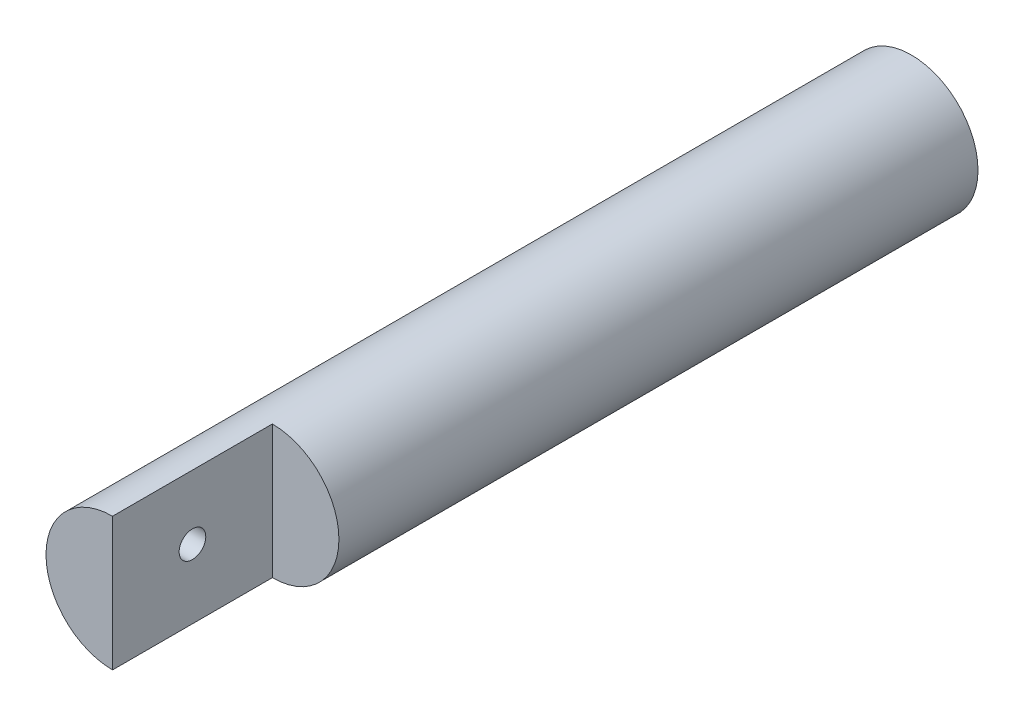
ISO-10303-21;
HEADER;
FILE_DESCRIPTION(('STEP AP214'),'2;1');
FILE_NAME('part.step','',(''),(''),'','','');
FILE_SCHEMA(('AUTOMOTIVE_DESIGN { 1 0 10303 214 1 1 1 1 }'));
ENDSEC;
DATA;
#1=APPLICATION_CONTEXT('core data for automotive mechanical design processes');
#2=APPLICATION_PROTOCOL_DEFINITION('international standard','automotive_design',2000,#1);
#3=PRODUCT_CONTEXT('',#1,'mechanical');
#4=PRODUCT('Part','Part','',(#3));
#5=PRODUCT_RELATED_PRODUCT_CATEGORY('part','',(#4));
#6=PRODUCT_DEFINITION_FORMATION('','',#4);
#7=PRODUCT_DEFINITION_CONTEXT('part definition',#1,'design');
#8=PRODUCT_DEFINITION('design','',#6,#7);
#9=PRODUCT_DEFINITION_SHAPE('','',#8);
#10=(LENGTH_UNIT() NAMED_UNIT(*) SI_UNIT(.MILLI.,.METRE.));
#11=(NAMED_UNIT(*) PLANE_ANGLE_UNIT() SI_UNIT($,.RADIAN.));
#12=(NAMED_UNIT(*) SI_UNIT($,.STERADIAN.) SOLID_ANGLE_UNIT());
#13=UNCERTAINTY_MEASURE_WITH_UNIT(LENGTH_MEASURE(1.E-05),#10,'distance_accuracy_value','');
#14=(GEOMETRIC_REPRESENTATION_CONTEXT(3) GLOBAL_UNCERTAINTY_ASSIGNED_CONTEXT((#13)) GLOBAL_UNIT_ASSIGNED_CONTEXT((#10,
#11,#12)) REPRESENTATION_CONTEXT('',''));
#15=CARTESIAN_POINT('',(0.,0.,0.));
#16=DIRECTION('',(0.,0.,1.));
#17=DIRECTION('',(1.,0.,0.));
#18=AXIS2_PLACEMENT_3D('',#15,#16,#17);
#19=CARTESIAN_POINT('',(-15.,14.5516434419051,0.));
#20=DIRECTION('',(0.,0.,1.));
#21=DIRECTION('',(1.,0.,0.));
#22=AXIS2_PLACEMENT_3D('',#19,#20,#21);
#23=CYLINDRICAL_SURFACE('',#22,12.5);
#24=CARTESIAN_POINT('',(-27.1473121967923,17.5,135.));
#25=CARTESIAN_POINT('',(-27.1473151811214,17.499994783224,135.138189718652));
#26=CARTESIAN_POINT('',(-27.1501207888977,17.4885016089958,135.276443968881));
#27=CARTESIAN_POINT('',(-27.1610538501701,17.4428885369739,135.549020306055));
#28=CARTESIAN_POINT('',(-27.1691855975325,17.4087503827998,135.683339128955));
#29=CARTESIAN_POINT('',(-27.1899071159469,17.3190011168326,135.944040910274));
#30=CARTESIAN_POINT('',(-27.2024914426384,17.2634162214158,136.070433339431));
#31=CARTESIAN_POINT('',(-27.2308592986463,17.1324476865675,136.312082243326));
#32=CARTESIAN_POINT('',(-27.2466427241401,17.0570646896347,136.427339079278));
#33=CARTESIAN_POINT('',(-27.2801910953276,16.8871337064821,136.645656935151));
#34=CARTESIAN_POINT('',(-27.2979853979138,16.792279027384,136.748474716832));
#35=CARTESIAN_POINT('',(-27.3336556810894,16.5867835472072,136.936893123392));
#36=CARTESIAN_POINT('',(-27.3515316704705,16.4761410062768,137.022491848191));
#37=CARTESIAN_POINT('',(-27.3860206817771,16.2401095367449,137.175363284552));
#38=CARTESIAN_POINT('',(-27.4026092372259,16.1145149344173,137.242324512209));
#39=CARTESIAN_POINT('',(-27.4327175271507,15.8534786557579,137.354087265449));
#40=CARTESIAN_POINT('',(-27.4462374930241,15.7180377229403,137.398890462236));
#41=CARTESIAN_POINT('',(-27.4689513542941,15.4427640372149,137.464497449977));
#42=CARTESIAN_POINT('',(-27.4781932225845,15.302999723054,137.485571372369));
#43=CARTESIAN_POINT('',(-27.4919522836441,15.021693481627,137.503874921992));
#44=CARTESIAN_POINT('',(-27.4964700770762,14.8801517826708,137.501107581037));
#45=CARTESIAN_POINT('',(-27.5006563866676,14.6021802406895,137.472022918734));
#46=CARTESIAN_POINT('',(-27.5004158035186,14.4657043925119,137.446156045518));
#47=CARTESIAN_POINT('',(-27.4957364412924,14.1989790748568,137.372238890318));
#48=CARTESIAN_POINT('',(-27.4912976474468,14.0687296272844,137.324188530297));
#49=CARTESIAN_POINT('',(-27.4790903686715,13.8181188825354,137.207322341279));
#50=CARTESIAN_POINT('',(-27.471322526986,13.6977556804732,137.138510524605));
#51=CARTESIAN_POINT('',(-27.4536493795241,13.4701306067353,136.982063697337));
#52=CARTESIAN_POINT('',(-27.4437438746632,13.362869956783,136.894426933545));
#53=CARTESIAN_POINT('',(-27.4230203953604,13.16281386492,136.701283188661));
#54=CARTESIAN_POINT('',(-27.412191019268,13.0702579099122,136.595529274585));
#55=CARTESIAN_POINT('',(-27.3912330018651,12.9041063412381,136.369981949075));
#56=CARTESIAN_POINT('',(-27.3811043859848,12.8305114153915,136.250188028563));
#57=CARTESIAN_POINT('',(-27.3628606248043,12.7039947366642,135.999115265675));
#58=CARTESIAN_POINT('',(-27.3547574054638,12.6511944254315,135.867774281029));
#59=CARTESIAN_POINT('',(-27.3417482306406,12.5684589273408,135.597928940286));
#60=CARTESIAN_POINT('',(-27.3368420060067,12.5385218156199,135.459425188274));
#61=CARTESIAN_POINT('',(-27.3309322249442,12.5026333097286,135.180777749491));
#62=CARTESIAN_POINT('',(-27.3298872913858,12.4964275875782,135.040667686212));
#63=CARTESIAN_POINT('',(-27.3317262490066,12.5074913402323,134.761408287432));
#64=CARTESIAN_POINT('',(-27.3346099838481,12.524759880901,134.622258913923));
#65=CARTESIAN_POINT('',(-27.343883033335,12.5820307091861,134.349877964761));
#66=CARTESIAN_POINT('',(-27.350247513811,12.6218720178426,134.216611610922));
#67=CARTESIAN_POINT('',(-27.3656230022268,12.7229917050557,133.958640120953));
#68=CARTESIAN_POINT('',(-27.3746341863197,12.7842715105175,133.833935555341));
#69=CARTESIAN_POINT('',(-27.3942093278694,12.9272030185633,133.595354242747));
#70=CARTESIAN_POINT('',(-27.4047869293806,13.0090386386703,133.48158881543));
#71=CARTESIAN_POINT('',(-27.4260093963513,13.1905344444189,133.269295112545));
#72=CARTESIAN_POINT('',(-27.4366542661749,13.2901957982275,133.170767836362));
#73=CARTESIAN_POINT('',(-27.4566299922017,13.5056250787398,132.990842174378));
#74=CARTESIAN_POINT('',(-27.4659480250693,13.6215311735444,132.909607623611));
#75=CARTESIAN_POINT('',(-27.4817530105633,13.8655214924414,132.767766357759));
#76=CARTESIAN_POINT('',(-27.4882401515116,13.9936049057606,132.70715827058));
#77=CARTESIAN_POINT('',(-27.4972198535296,14.2571622706154,132.60880650432));
#78=CARTESIAN_POINT('',(-27.4997459396012,14.3925640505738,132.57087263316));
#79=CARTESIAN_POINT('',(-27.5002172298003,14.6678097453532,132.518210690965));
#80=CARTESIAN_POINT('',(-27.4981628888401,14.8076532176809,132.503480315687));
#81=CARTESIAN_POINT('',(-27.4893493757268,15.0857187801794,132.497656394444));
#82=CARTESIAN_POINT('',(-27.4826562114315,15.2239362863823,132.506236099878));
#83=CARTESIAN_POINT('',(-27.4649663561194,15.4967955665163,132.545982013622));
#84=CARTESIAN_POINT('',(-27.4539695655223,15.6314372576308,132.57714874458));
#85=CARTESIAN_POINT('',(-27.4284171237128,15.8940042584085,132.661230887112));
#86=CARTESIAN_POINT('',(-27.4138468215077,16.0218992154971,132.714236459674));
#87=CARTESIAN_POINT('',(-27.3823608327385,16.2669937293947,132.840432384158));
#88=CARTESIAN_POINT('',(-27.3654448944515,16.384192136057,132.913624903286));
#89=CARTESIAN_POINT('',(-27.3303738653018,16.6070944150393,133.07985387096));
#90=CARTESIAN_POINT('',(-27.3122007458998,16.7125211757587,133.173258278037));
#91=CARTESIAN_POINT('',(-27.2766144917667,16.9063127645512,133.37651840847));
#92=CARTESIAN_POINT('',(-27.2592015372508,16.9946735635493,133.486378005863));
#93=CARTESIAN_POINT('',(-27.2266946397217,17.1525095519919,133.720617576492));
#94=CARTESIAN_POINT('',(-27.2116216537585,17.2218179281857,133.845112974434));
#95=CARTESIAN_POINT('',(-27.1855556484076,17.3383673075485,134.104347906367));
#96=CARTESIAN_POINT('',(-27.174558642279,17.3856298856096,134.23907727416));
#97=CARTESIAN_POINT('',(-27.1600232955559,17.4472493901265,134.478476591027));
#98=CARTESIAN_POINT('',(-27.1552834555258,17.4669939082246,134.581720301172));
#99=CARTESIAN_POINT('',(-27.1489268449718,17.4933708892488,134.789963634962));
#100=CARTESIAN_POINT('',(-27.1473099284293,17.5000039652268,134.894963176276));
#101=CARTESIAN_POINT('',(-27.1473121967923,17.5,135.));
#102=B_SPLINE_CURVE_WITH_KNOTS('',3,(#24,#25,#26,#27,#28,#29,#30,#31,#32,#33,#34,#35,#36,#37,
#38,#39,#40,#41,#42,#43,#44,#45,#46,#47,#48,#49,#50,#51,#52,#53,#54,#55,#56,#57,#58,#59,#60,#61,
#62,#63,#64,#65,#66,#67,#68,#69,#70,#71,#72,#73,#74,#75,#76,#77,#78,#79,#80,#81,#82,#83,#84,#85,
#86,#87,#88,#89,#90,#91,#92,#93,#94,#95,#96,#97,#98,#99,#100,#101),.UNSPECIFIED.,.T.,.F.,(4,2,2,
2,2,2,2,2,2,2,2,2,2,2,2,2,2,2,2,2,2,2,2,2,2,2,2,2,2,2,2,2,2,2,2,2,2,2,4),(0.,0.414182414257523,
0.828699148822064,1.24271077760947,1.65670897233061,2.07781185959024,2.49896118906234,
2.92677597157021,3.35455848250856,3.77742031205905,4.20022836847666,4.61496733353113,
5.02970775755974,5.44436808085759,5.85906703893291,6.2799483541247,6.70084493482595,
7.12416436349521,7.54744814878416,7.96618270103453,8.38490059063245,8.80066929352104,
9.21646567444383,9.63612375086722,10.0558093386656,10.4793096976337,10.9027818794141,
11.3226502118987,11.7424768463698,12.1564490430888,12.570430819137,12.9861391100589,
13.4018920474954,13.8259688173246,14.2501455846903,14.6779258052326,15.1052865001865,
15.4201177332191,15.7349342453307),.UNSPECIFIED.);
#103=CARTESIAN_POINT('',(-27.1473121967923,17.5,135.));
#104=VERTEX_POINT('',#103);
#105=EDGE_CURVE('E58',#104,#104,#102,.T.);
#106=ORIENTED_EDGE('',*,*,#105,.T.);
#107=EDGE_LOOP('',(#106));
#108=FACE_BOUND('',#107,.T.);
#109=CARTESIAN_POINT('',(-15.,14.5516434419051,0.));
#110=DIRECTION('',(0.,0.,1.));
#111=DIRECTION('',(1.,0.,0.));
#112=AXIS2_PLACEMENT_3D('',#109,#110,#111);
#113=CIRCLE('',#112,12.5);
#114=CARTESIAN_POINT('',(-2.5,14.5516434419051,0.));
#115=VERTEX_POINT('',#114);
#116=EDGE_CURVE('E89',#115,#115,#113,.T.);
#117=ORIENTED_EDGE('',*,*,#116,.T.);
#118=EDGE_LOOP('',(#117));
#119=FACE_BOUND('',#118,.T.);
#120=CARTESIAN_POINT('',(-15.,14.5516434419051,150.));
#121=DIRECTION('',(0.,0.,1.));
#122=DIRECTION('',(1.,0.,0.));
#123=AXIS2_PLACEMENT_3D('',#120,#121,#122);
#124=CIRCLE('',#123,12.5);
#125=CARTESIAN_POINT('',(-15.,27.0516434419051,150.));
#126=VERTEX_POINT('',#125);
#127=CARTESIAN_POINT('',(-15.,2.05164344190507,150.));
#128=VERTEX_POINT('',#127);
#129=EDGE_CURVE('E86',#126,#128,#124,.T.);
#130=ORIENTED_EDGE('',*,*,#129,.F.);
#131=DIRECTION('',(0.,0.,1.));
#132=VECTOR('',#131,1.);
#133=CARTESIAN_POINT('',(-15.,27.0516434419051,120.));
#134=LINE('',#133,#132);
#135=CARTESIAN_POINT('',(-15.,27.0516434419051,120.));
#136=VERTEX_POINT('',#135);
#137=EDGE_CURVE('E65',#136,#126,#134,.T.);
#138=ORIENTED_EDGE('',*,*,#137,.F.);
#139=CARTESIAN_POINT('',(-15.,14.5516434419051,120.));
#140=DIRECTION('',(0.,0.,1.));
#141=DIRECTION('',(1.,0.,0.));
#142=AXIS2_PLACEMENT_3D('',#139,#140,#141);
#143=CIRCLE('',#142,12.5);
#144=CARTESIAN_POINT('',(-15.,2.05164344190507,120.));
#145=VERTEX_POINT('',#144);
#146=EDGE_CURVE('E13',#136,#145,#143,.F.);
#147=ORIENTED_EDGE('',*,*,#146,.T.);
#148=DIRECTION('',(0.,0.,1.));
#149=VECTOR('',#148,1.);
#150=CARTESIAN_POINT('',(-15.,2.05164344190507,120.));
#151=LINE('',#150,#149);
#152=EDGE_CURVE('E79',#145,#128,#151,.T.);
#153=ORIENTED_EDGE('',*,*,#152,.T.);
#154=EDGE_LOOP('',(#130,#138,#147,#153));
#155=FACE_BOUND('',#154,.T.);
#156=ADVANCED_FACE('F50',(#108,#119,#155),#23,.T.);
#157=CARTESIAN_POINT('',(-30.,15.,135.));
#158=DIRECTION('',(1.,0.,0.));
#159=DIRECTION('',(0.,1.,0.));
#160=AXIS2_PLACEMENT_3D('',#157,#158,#159);
#161=CYLINDRICAL_SURFACE('',#160,2.5);
#162=CARTESIAN_POINT('',(-15.,15.,135.));
#163=DIRECTION('',(-1.,0.,0.));
#164=DIRECTION('',(0.,0.,1.));
#165=AXIS2_PLACEMENT_3D('',#162,#163,#164);
#166=CIRCLE('',#165,2.5);
#167=CARTESIAN_POINT('',(-15.,15.,137.5));
#168=VERTEX_POINT('',#167);
#169=EDGE_CURVE('E178',#168,#168,#166,.F.);
#170=ORIENTED_EDGE('',*,*,#169,.T.);
#171=EDGE_LOOP('',(#170));
#172=FACE_BOUND('',#171,.T.);
#173=ORIENTED_EDGE('',*,*,#105,.F.);
#174=EDGE_LOOP('',(#173));
#175=FACE_BOUND('',#174,.T.);
#176=ADVANCED_FACE('F104',(#172,#175),#161,.F.);
#177=CARTESIAN_POINT('',(0.,0.,0.));
#178=DIRECTION('',(0.,0.,1.));
#179=DIRECTION('',(1.,0.,0.));
#180=AXIS2_PLACEMENT_3D('',#177,#178,#179);
#181=PLANE('',#180);
#182=CARTESIAN_POINT('',(-15.,14.5516434419051,0.));
#183=DIRECTION('',(0.,0.,-1.));
#184=DIRECTION('',(-1.,0.,0.));
#185=AXIS2_PLACEMENT_3D('',#182,#183,#184);
#186=CIRCLE('',#185,11.5);
#187=CARTESIAN_POINT('',(-26.5,14.5516434419051,0.));
#188=VERTEX_POINT('',#187);
#189=EDGE_CURVE('E95',#188,#188,#186,.T.);
#190=ORIENTED_EDGE('',*,*,#189,.F.);
#191=EDGE_LOOP('',(#190));
#192=FACE_BOUND('',#191,.T.);
#193=ORIENTED_EDGE('',*,*,#116,.F.);
#194=EDGE_LOOP('',(#193));
#195=FACE_BOUND('',#194,.T.);
#196=ADVANCED_FACE('F52',(#192,#195),#181,.F.);
#197=CARTESIAN_POINT('',(0.,0.,150.));
#198=DIRECTION('',(0.,0.,1.));
#199=DIRECTION('',(1.,0.,0.));
#200=AXIS2_PLACEMENT_3D('',#197,#198,#199);
#201=PLANE('',#200);
#202=DIRECTION('',(0.,-1.,0.));
#203=VECTOR('',#202,1.);
#204=CARTESIAN_POINT('',(-15.,27.0516434419051,150.));
#205=LINE('',#204,#203);
#206=EDGE_CURVE('E75',#126,#128,#205,.T.);
#207=ORIENTED_EDGE('',*,*,#206,.F.);
#208=ORIENTED_EDGE('',*,*,#129,.T.);
#209=EDGE_LOOP('',(#207,#208));
#210=FACE_BOUND('',#209,.T.);
#211=ADVANCED_FACE('F88',(#210),#201,.T.);
#212=CARTESIAN_POINT('',(-15.,14.5516434419051,110.));
#213=DIRECTION('',(0.,0.,-1.));
#214=DIRECTION('',(-1.,0.,0.));
#215=AXIS2_PLACEMENT_3D('',#212,#213,#214);
#216=CYLINDRICAL_SURFACE('',#215,11.5);
#217=CARTESIAN_POINT('',(-15.,14.5516434419051,110.));
#218=DIRECTION('',(0.,0.,-1.));
#219=DIRECTION('',(-1.,0.,0.));
#220=AXIS2_PLACEMENT_3D('',#217,#218,#219);
#221=CIRCLE('',#220,11.5);
#222=CARTESIAN_POINT('',(-26.5,14.5516434419051,110.));
#223=VERTEX_POINT('',#222);
#224=EDGE_CURVE('E90',#223,#223,#221,.T.);
#225=ORIENTED_EDGE('',*,*,#224,.F.);
#226=EDGE_LOOP('',(#225));
#227=FACE_BOUND('',#226,.T.);
#228=ORIENTED_EDGE('',*,*,#189,.T.);
#229=EDGE_LOOP('',(#228));
#230=FACE_BOUND('',#229,.T.);
#231=ADVANCED_FACE('F110',(#227,#230),#216,.F.);
#232=CARTESIAN_POINT('',(-15.,14.5516434419051,110.));
#233=DIRECTION('',(0.,0.,-1.));
#234=DIRECTION('',(-1.,0.,0.));
#235=AXIS2_PLACEMENT_3D('',#232,#233,#234);
#236=PLANE('',#235);
#237=ORIENTED_EDGE('',*,*,#224,.T.);
#238=EDGE_LOOP('',(#237));
#239=FACE_BOUND('',#238,.T.);
#240=ADVANCED_FACE('F113',(#239),#236,.T.);
#241=CARTESIAN_POINT('',(-15.,27.0516434419051,120.));
#242=DIRECTION('',(-1.,0.,0.));
#243=DIRECTION('',(0.,0.,1.));
#244=AXIS2_PLACEMENT_3D('',#241,#242,#243);
#245=PLANE('',#244);
#246=ORIENTED_EDGE('',*,*,#206,.T.);
#247=ORIENTED_EDGE('',*,*,#152,.F.);
#248=DIRECTION('',(0.,-1.,0.));
#249=VECTOR('',#248,1.);
#250=CARTESIAN_POINT('',(-15.,27.0516434419051,120.));
#251=LINE('',#250,#249);
#252=EDGE_CURVE('E83',#136,#145,#251,.T.);
#253=ORIENTED_EDGE('',*,*,#252,.F.);
#254=ORIENTED_EDGE('',*,*,#137,.T.);
#255=EDGE_LOOP('',(#246,#247,#253,#254));
#256=FACE_BOUND('',#255,.T.);
#257=ORIENTED_EDGE('',*,*,#169,.F.);
#258=EDGE_LOOP('',(#257));
#259=FACE_BOUND('',#258,.T.);
#260=ADVANCED_FACE('F77',(#256,#259),#245,.F.);
#261=CARTESIAN_POINT('',(0.,0.,120.));
#262=DIRECTION('',(0.,0.,1.));
#263=DIRECTION('',(1.,0.,0.));
#264=AXIS2_PLACEMENT_3D('',#261,#262,#263);
#265=PLANE('',#264);
#266=ORIENTED_EDGE('',*,*,#146,.F.);
#267=ORIENTED_EDGE('',*,*,#252,.T.);
#268=EDGE_LOOP('',(#266,#267));
#269=FACE_BOUND('',#268,.T.);
#270=ADVANCED_FACE('F120',(#269),#265,.T.);
#271=CLOSED_SHELL('',(#156,#176,#196,#211,#231,#240,#260,#270));
#272=MANIFOLD_SOLID_BREP('B2',#271);
#273=ADVANCED_BREP_SHAPE_REPRESENTATION('',(#18,#272),#14);
#274=SHAPE_DEFINITION_REPRESENTATION(#9,#273);
ENDSEC;
END-ISO-10303-21;
